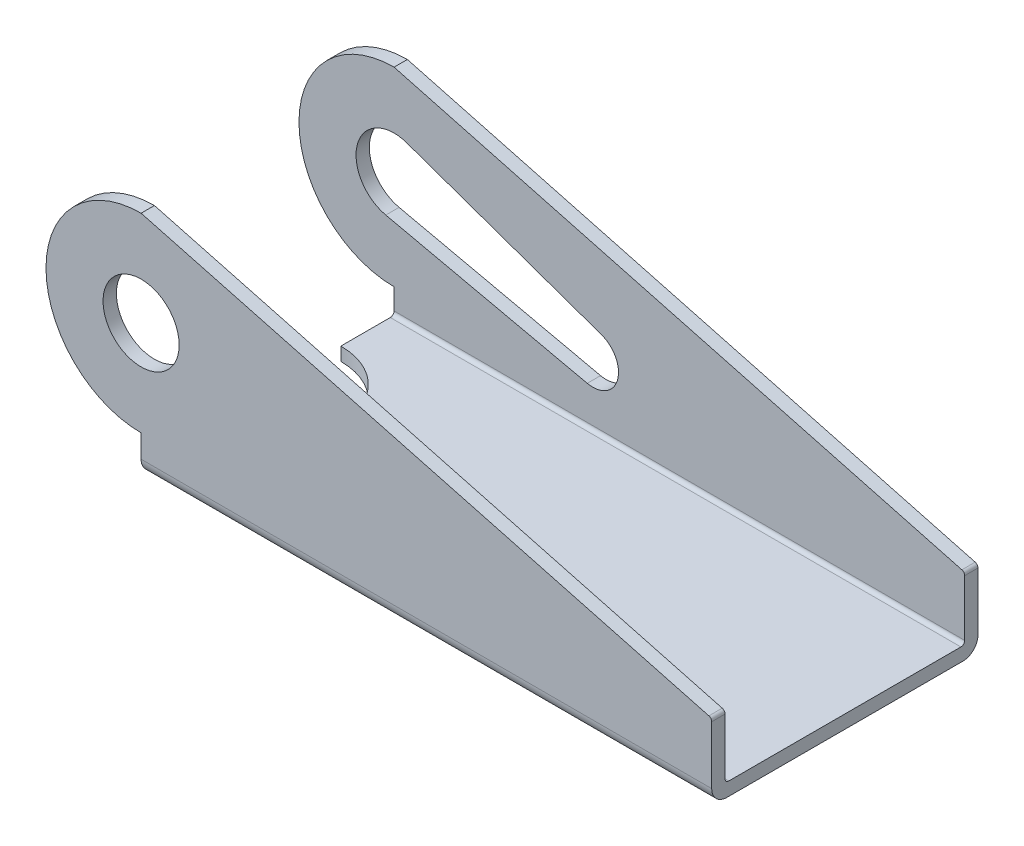
ISO-10303-21;
HEADER;
FILE_DESCRIPTION(('STEP AP214'),'2;1');
FILE_NAME('part.step','',(''),(''),'','','');
FILE_SCHEMA(('AUTOMOTIVE_DESIGN { 1 0 10303 214 1 1 1 1 }'));
ENDSEC;
DATA;
#1=APPLICATION_CONTEXT('core data for automotive mechanical design processes');
#2=APPLICATION_PROTOCOL_DEFINITION('international standard','automotive_design',2000,#1);
#3=PRODUCT_CONTEXT('',#1,'mechanical');
#4=PRODUCT('Part','Part','',(#3));
#5=PRODUCT_RELATED_PRODUCT_CATEGORY('part','',(#4));
#6=PRODUCT_DEFINITION_FORMATION('','',#4);
#7=PRODUCT_DEFINITION_CONTEXT('part definition',#1,'design');
#8=PRODUCT_DEFINITION('design','',#6,#7);
#9=PRODUCT_DEFINITION_SHAPE('','',#8);
#10=(LENGTH_UNIT() NAMED_UNIT(*) SI_UNIT(.MILLI.,.METRE.));
#11=(NAMED_UNIT(*) PLANE_ANGLE_UNIT() SI_UNIT($,.RADIAN.));
#12=(NAMED_UNIT(*) SI_UNIT($,.STERADIAN.) SOLID_ANGLE_UNIT());
#13=UNCERTAINTY_MEASURE_WITH_UNIT(LENGTH_MEASURE(1.E-05),#10,'distance_accuracy_value','');
#14=(GEOMETRIC_REPRESENTATION_CONTEXT(3) GLOBAL_UNCERTAINTY_ASSIGNED_CONTEXT((#13)) GLOBAL_UNIT_ASSIGNED_CONTEXT((#10,
#11,#12)) REPRESENTATION_CONTEXT('',''));
#15=CARTESIAN_POINT('',(0.,0.,0.));
#16=DIRECTION('',(0.,0.,1.));
#17=DIRECTION('',(1.,0.,0.));
#18=AXIS2_PLACEMENT_3D('',#15,#16,#17);
#19=CARTESIAN_POINT('',(-19.05,8.89,8.89));
#20=DIRECTION('',(0.,0.,1.));
#21=DIRECTION('',(1.,0.,0.));
#22=AXIS2_PLACEMENT_3D('',#19,#20,#21);
#23=CYLINDRICAL_SURFACE('',#22,2.54);
#24=DIRECTION('',(0.,0.,1.));
#25=VECTOR('',#24,1.);
#26=CARTESIAN_POINT('',(-18.2044160336769,11.2851174826921,-8.89));
#27=LINE('',#26,#25);
#28=CARTESIAN_POINT('',(-18.2044160336769,11.2851174826921,-8.89));
#29=VERTEX_POINT('',#28);
#30=CARTESIAN_POINT('',(-18.2044160336769,11.2851174826921,-8.001));
#31=VERTEX_POINT('',#30);
#32=EDGE_CURVE('E418',#29,#31,#27,.T.);
#33=ORIENTED_EDGE('',*,*,#32,.T.);
#34=CARTESIAN_POINT('',(-19.05,8.89,-8.001));
#35=DIRECTION('',(0.,0.,-1.));
#36=DIRECTION('',(0.,1.,0.));
#37=AXIS2_PLACEMENT_3D('',#34,#35,#36);
#38=CIRCLE('',#37,2.54);
#39=CARTESIAN_POINT('',(-19.603662052658,6.41107718324137,-8.001));
#40=VERTEX_POINT('',#39);
#41=EDGE_CURVE('E208',#40,#31,#38,.T.);
#42=ORIENTED_EDGE('',*,*,#41,.F.);
#43=DIRECTION('',(0.,0.,1.));
#44=VECTOR('',#43,1.);
#45=CARTESIAN_POINT('',(-19.603662052658,6.41107718324137,-8.89));
#46=LINE('',#45,#44);
#47=CARTESIAN_POINT('',(-19.603662052658,6.41107718324137,-8.89));
#48=VERTEX_POINT('',#47);
#49=EDGE_CURVE('E191',#48,#40,#46,.T.);
#50=ORIENTED_EDGE('',*,*,#49,.F.);
#51=CARTESIAN_POINT('',(-19.05,8.89,-8.89));
#52=DIRECTION('',(0.,0.,1.));
#53=DIRECTION('',(1.,0.,0.));
#54=AXIS2_PLACEMENT_3D('',#51,#52,#53);
#55=CIRCLE('',#54,2.54);
#56=EDGE_CURVE('E206',#29,#48,#55,.T.);
#57=ORIENTED_EDGE('',*,*,#56,.F.);
#58=EDGE_LOOP('',(#33,#42,#50,#57));
#59=FACE_BOUND('',#58,.T.);
#60=ADVANCED_FACE('F41',(#59),#23,.F.);
#61=CARTESIAN_POINT('',(-19.05,0.,-8.89));
#62=DIRECTION('',(-1.,0.,0.));
#63=DIRECTION('',(0.,0.,1.));
#64=AXIS2_PLACEMENT_3D('',#61,#62,#63);
#65=PLANE('',#64);
#66=DIRECTION('',(0.,0.,1.));
#67=VECTOR('',#66,1.);
#68=CARTESIAN_POINT('',(-19.05,0.,-8.89));
#69=LINE('',#68,#67);
#70=CARTESIAN_POINT('',(-19.05,0.,4.445));
#71=VERTEX_POINT('',#70);
#72=CARTESIAN_POINT('',(-19.05,0.,7.874));
#73=VERTEX_POINT('',#72);
#74=EDGE_CURVE('E265',#71,#73,#69,.T.);
#75=ORIENTED_EDGE('',*,*,#74,.T.);
#76=CARTESIAN_POINT('',(-19.05,1.016,7.874));
#77=DIRECTION('',(-1.,0.,0.));
#78=DIRECTION('',(0.,0.,1.));
#79=AXIS2_PLACEMENT_3D('',#76,#77,#78);
#80=CIRCLE('',#79,1.016);
#81=CARTESIAN_POINT('',(-19.05,1.016,8.89));
#82=VERTEX_POINT('',#81);
#83=EDGE_CURVE('E331',#73,#82,#80,.T.);
#84=ORIENTED_EDGE('',*,*,#83,.T.);
#85=DIRECTION('',(0.,-1.,0.));
#86=VECTOR('',#85,1.);
#87=CARTESIAN_POINT('',(-19.05,0.,8.89));
#88=LINE('',#87,#86);
#89=CARTESIAN_POINT('',(-19.05,2.54,8.89));
#90=VERTEX_POINT('',#89);
#91=EDGE_CURVE('E246',#90,#82,#88,.T.);
#92=ORIENTED_EDGE('',*,*,#91,.F.);
#93=DIRECTION('',(0.,0.,1.));
#94=VECTOR('',#93,1.);
#95=CARTESIAN_POINT('',(-19.05,2.54,-8.89));
#96=LINE('',#95,#94);
#97=CARTESIAN_POINT('',(-19.05,2.54,8.001));
#98=VERTEX_POINT('',#97);
#99=EDGE_CURVE('E270',#98,#90,#96,.T.);
#100=ORIENTED_EDGE('',*,*,#99,.F.);
#101=DIRECTION('',(0.,1.,0.));
#102=VECTOR('',#101,1.);
#103=CARTESIAN_POINT('',(-19.05,0.,8.00099999999999));
#104=LINE('',#103,#102);
#105=CARTESIAN_POINT('',(-19.05,1.143,8.00099999999999));
#106=VERTEX_POINT('',#105);
#107=EDGE_CURVE('E234',#106,#98,#104,.T.);
#108=ORIENTED_EDGE('',*,*,#107,.F.);
#109=CARTESIAN_POINT('',(-19.05,1.143,7.747));
#110=DIRECTION('',(-1.,0.,0.));
#111=DIRECTION('',(0.,0.,1.));
#112=AXIS2_PLACEMENT_3D('',#109,#110,#111);
#113=CIRCLE('',#112,0.254);
#114=CARTESIAN_POINT('',(-19.05,0.889,7.747));
#115=VERTEX_POINT('',#114);
#116=EDGE_CURVE('E313',#106,#115,#113,.F.);
#117=ORIENTED_EDGE('',*,*,#116,.T.);
#118=DIRECTION('',(0.,0.,1.));
#119=VECTOR('',#118,1.);
#120=CARTESIAN_POINT('',(-19.05,0.889,-8.89));
#121=LINE('',#120,#119);
#122=CARTESIAN_POINT('',(-19.05,0.889,4.445));
#123=VERTEX_POINT('',#122);
#124=EDGE_CURVE('E236',#123,#115,#121,.T.);
#125=ORIENTED_EDGE('',*,*,#124,.F.);
#126=DIRECTION('',(0.,1.,0.));
#127=VECTOR('',#126,1.);
#128=CARTESIAN_POINT('',(-19.05,0.889,4.445));
#129=LINE('',#128,#127);
#130=EDGE_CURVE('E218',#71,#123,#129,.T.);
#131=ORIENTED_EDGE('',*,*,#130,.F.);
#132=EDGE_LOOP('',(#75,#84,#92,#100,#108,#117,#125,#131));
#133=FACE_BOUND('',#132,.T.);
#134=ADVANCED_FACE('F336',(#133),#65,.T.);
#135=CARTESIAN_POINT('',(-19.05,0.,-8.89));
#136=DIRECTION('',(0.,-1.,0.));
#137=DIRECTION('',(1.,0.,0.));
#138=AXIS2_PLACEMENT_3D('',#135,#136,#137);
#139=PLANE('',#138);
#140=DIRECTION('',(0.,0.,1.));
#141=VECTOR('',#140,1.);
#142=CARTESIAN_POINT('',(19.05,0.,-8.89));
#143=LINE('',#142,#141);
#144=CARTESIAN_POINT('',(19.05,0.,-7.874));
#145=VERTEX_POINT('',#144);
#146=CARTESIAN_POINT('',(19.05,0.,7.874));
#147=VERTEX_POINT('',#146);
#148=EDGE_CURVE('E275',#145,#147,#143,.T.);
#149=ORIENTED_EDGE('',*,*,#148,.T.);
#150=DIRECTION('',(1.,0.,0.));
#151=VECTOR('',#150,1.);
#152=CARTESIAN_POINT('',(-19.05,0.,7.874));
#153=LINE('',#152,#151);
#154=EDGE_CURVE('E329',#147,#73,#153,.F.);
#155=ORIENTED_EDGE('',*,*,#154,.T.);
#156=ORIENTED_EDGE('',*,*,#74,.F.);
#157=CARTESIAN_POINT('',(-19.05,0.,0.));
#158=DIRECTION('',(0.,1.,0.));
#159=DIRECTION('',(0.,0.,1.));
#160=AXIS2_PLACEMENT_3D('',#157,#158,#159);
#161=CIRCLE('',#160,4.445);
#162=CARTESIAN_POINT('',(-19.05,0.,-4.445));
#163=VERTEX_POINT('',#162);
#164=EDGE_CURVE('E407',#71,#163,#161,.T.);
#165=ORIENTED_EDGE('',*,*,#164,.T.);
#166=CARTESIAN_POINT('',(-19.05,0.,-7.874));
#167=VERTEX_POINT('',#166);
#168=EDGE_CURVE('E278',#167,#163,#69,.T.);
#169=ORIENTED_EDGE('',*,*,#168,.F.);
#170=DIRECTION('',(1.,0.,0.));
#171=VECTOR('',#170,1.);
#172=CARTESIAN_POINT('',(-19.05,0.,-7.874));
#173=LINE('',#172,#171);
#174=EDGE_CURVE('E326',#167,#145,#173,.T.);
#175=ORIENTED_EDGE('',*,*,#174,.T.);
#176=EDGE_LOOP('',(#149,#155,#156,#165,#169,#175));
#177=FACE_BOUND('',#176,.T.);
#178=ADVANCED_FACE('F352',(#177),#139,.T.);
#179=CARTESIAN_POINT('',(-19.05,8.89,-8.89));
#180=DIRECTION('',(0.,0.,1.));
#181=DIRECTION('',(1.,0.,0.));
#182=AXIS2_PLACEMENT_3D('',#179,#180,#181);
#183=CYLINDRICAL_SURFACE('',#182,6.35);
#184=CARTESIAN_POINT('',(-19.05,8.89,-8.001));
#185=DIRECTION('',(0.,0.,-1.));
#186=DIRECTION('',(0.,1.,0.));
#187=AXIS2_PLACEMENT_3D('',#184,#185,#186);
#188=CIRCLE('',#187,6.35);
#189=CARTESIAN_POINT('',(-19.0499999999999,15.24,-8.001));
#190=VERTEX_POINT('',#189);
#191=CARTESIAN_POINT('',(-19.05,2.54,-8.001));
#192=VERTEX_POINT('',#191);
#193=EDGE_CURVE('E241',#190,#192,#188,.F.);
#194=ORIENTED_EDGE('',*,*,#193,.F.);
#195=DIRECTION('',(0.,0.,1.));
#196=VECTOR('',#195,1.);
#197=CARTESIAN_POINT('',(-19.05,15.24,-8.89));
#198=LINE('',#197,#196);
#199=CARTESIAN_POINT('',(-19.05,15.24,-8.89));
#200=VERTEX_POINT('',#199);
#201=EDGE_CURVE('E271',#200,#190,#198,.T.);
#202=ORIENTED_EDGE('',*,*,#201,.F.);
#203=CARTESIAN_POINT('',(-19.05,8.89,-8.89));
#204=DIRECTION('',(0.,0.,1.));
#205=DIRECTION('',(-1.,0.,0.));
#206=AXIS2_PLACEMENT_3D('',#203,#204,#205);
#207=CIRCLE('',#206,6.35);
#208=CARTESIAN_POINT('',(-19.05,2.54,-8.89));
#209=VERTEX_POINT('',#208);
#210=EDGE_CURVE('E262',#200,#209,#207,.T.);
#211=ORIENTED_EDGE('',*,*,#210,.T.);
#212=EDGE_CURVE('E266',#209,#192,#96,.T.);
#213=ORIENTED_EDGE('',*,*,#212,.T.);
#214=EDGE_LOOP('',(#194,#202,#211,#213));
#215=FACE_BOUND('',#214,.T.);
#216=ADVANCED_FACE('F477',(#215),#183,.T.);
#217=CARTESIAN_POINT('',(19.05,5.08,-8.89));
#218=DIRECTION('',(0.257662650560332,0.966234939601246,0.));
#219=DIRECTION('',(-0.966234939601246,0.257662650560332,0.));
#220=AXIS2_PLACEMENT_3D('',#217,#218,#219);
#221=PLANE('',#220);
#222=DIRECTION('',(-0.966234939601246,0.257662650560332,0.));
#223=VECTOR('',#222,1.);
#224=CARTESIAN_POINT('',(19.05,5.08,-8.001));
#225=LINE('',#224,#223);
#226=CARTESIAN_POINT('',(18.8614463132423,5.13028098313538,-8.001));
#227=VERTEX_POINT('',#226);
#228=EDGE_CURVE('E239',#227,#190,#225,.T.);
#229=ORIENTED_EDGE('',*,*,#228,.F.);
#230=DIRECTION('',(0.,0.,1.));
#231=VECTOR('',#230,1.);
#232=CARTESIAN_POINT('',(18.8614463132423,5.13028098313538,-8.89));
#233=LINE('',#232,#231);
#234=CARTESIAN_POINT('',(18.8614463132423,5.13028098313538,-8.89));
#235=VERTEX_POINT('',#234);
#236=EDGE_CURVE('E306',#227,#235,#233,.F.);
#237=ORIENTED_EDGE('',*,*,#236,.T.);
#238=DIRECTION('',(-0.966234939601246,0.257662650560332,0.));
#239=VECTOR('',#238,1.);
#240=CARTESIAN_POINT('',(19.05,5.08,-8.89));
#241=LINE('',#240,#239);
#242=EDGE_CURVE('E260',#235,#200,#241,.T.);
#243=ORIENTED_EDGE('',*,*,#242,.T.);
#244=ORIENTED_EDGE('',*,*,#201,.T.);
#245=EDGE_LOOP('',(#229,#237,#243,#244));
#246=FACE_BOUND('',#245,.T.);
#247=ADVANCED_FACE('F480',(#246),#221,.T.);
#248=DIRECTION('',(0.,-1.,0.));
#249=VECTOR('',#248,1.);
#250=CARTESIAN_POINT('',(-19.05,0.,-8.89));
#251=LINE('',#250,#249);
#252=CARTESIAN_POINT('',(-19.05,1.016,-8.89));
#253=VERTEX_POINT('',#252);
#254=EDGE_CURVE('E256',#209,#253,#251,.T.);
#255=ORIENTED_EDGE('',*,*,#254,.T.);
#256=CARTESIAN_POINT('',(-19.05,1.016,-7.874));
#257=DIRECTION('',(-1.,0.,0.));
#258=DIRECTION('',(0.,0.,1.));
#259=AXIS2_PLACEMENT_3D('',#256,#257,#258);
#260=CIRCLE('',#259,1.016);
#261=EDGE_CURVE('E11',#253,#167,#260,.T.);
#262=ORIENTED_EDGE('',*,*,#261,.T.);
#263=ORIENTED_EDGE('',*,*,#168,.T.);
#264=DIRECTION('',(0.,1.,0.));
#265=VECTOR('',#264,1.);
#266=CARTESIAN_POINT('',(-19.05,0.889,-4.445));
#267=LINE('',#266,#265);
#268=CARTESIAN_POINT('',(-19.05,0.889,-4.445));
#269=VERTEX_POINT('',#268);
#270=EDGE_CURVE('E406',#269,#163,#267,.F.);
#271=ORIENTED_EDGE('',*,*,#270,.F.);
#272=CARTESIAN_POINT('',(-19.05,0.889,-7.747));
#273=VERTEX_POINT('',#272);
#274=EDGE_CURVE('E237',#273,#269,#121,.T.);
#275=ORIENTED_EDGE('',*,*,#274,.F.);
#276=CARTESIAN_POINT('',(-19.05,1.143,-7.747));
#277=DIRECTION('',(-1.,0.,0.));
#278=DIRECTION('',(0.,0.,1.));
#279=AXIS2_PLACEMENT_3D('',#276,#277,#278);
#280=CIRCLE('',#279,0.254);
#281=CARTESIAN_POINT('',(-19.05,1.143,-8.001));
#282=VERTEX_POINT('',#281);
#283=EDGE_CURVE('E317',#273,#282,#280,.F.);
#284=ORIENTED_EDGE('',*,*,#283,.T.);
#285=DIRECTION('',(0.,-1.,0.));
#286=VECTOR('',#285,1.);
#287=CARTESIAN_POINT('',(-19.05,0.,-8.001));
#288=LINE('',#287,#286);
#289=EDGE_CURVE('E243',#192,#282,#288,.T.);
#290=ORIENTED_EDGE('',*,*,#289,.F.);
#291=ORIENTED_EDGE('',*,*,#212,.F.);
#292=EDGE_LOOP('',(#255,#262,#263,#271,#275,#284,#290,#291));
#293=FACE_BOUND('',#292,.T.);
#294=ADVANCED_FACE('F450',(#293),#65,.T.);
#295=CARTESIAN_POINT('',(-19.0499999999999,15.24,8.001));
#296=VERTEX_POINT('',#295);
#297=CARTESIAN_POINT('',(-19.05,15.24,8.89));
#298=VERTEX_POINT('',#297);
#299=EDGE_CURVE('E274',#296,#298,#198,.T.);
#300=ORIENTED_EDGE('',*,*,#299,.F.);
#301=CARTESIAN_POINT('',(-19.05,8.89,8.001));
#302=DIRECTION('',(0.,0.,1.));
#303=DIRECTION('',(0.,-1.,0.));
#304=AXIS2_PLACEMENT_3D('',#301,#302,#303);
#305=CIRCLE('',#304,6.35);
#306=EDGE_CURVE('E232',#98,#296,#305,.F.);
#307=ORIENTED_EDGE('',*,*,#306,.F.);
#308=ORIENTED_EDGE('',*,*,#99,.T.);
#309=CARTESIAN_POINT('',(-19.05,8.89,8.89));
#310=DIRECTION('',(0.,0.,1.));
#311=DIRECTION('',(-1.,0.,0.));
#312=AXIS2_PLACEMENT_3D('',#309,#310,#311);
#313=CIRCLE('',#312,6.35);
#314=EDGE_CURVE('E253',#298,#90,#313,.T.);
#315=ORIENTED_EDGE('',*,*,#314,.F.);
#316=EDGE_LOOP('',(#300,#307,#308,#315));
#317=FACE_BOUND('',#316,.T.);
#318=ADVANCED_FACE('F403',(#317),#183,.T.);
#319=DIRECTION('',(-0.966234939601246,0.257662650560332,0.));
#320=VECTOR('',#319,1.);
#321=CARTESIAN_POINT('',(19.05,5.08,8.89));
#322=LINE('',#321,#320);
#323=CARTESIAN_POINT('',(18.8614463132423,5.13028098313538,8.89));
#324=VERTEX_POINT('',#323);
#325=EDGE_CURVE('E251',#324,#298,#322,.T.);
#326=ORIENTED_EDGE('',*,*,#325,.F.);
#327=DIRECTION('',(0.,0.,1.));
#328=VECTOR('',#327,1.);
#329=CARTESIAN_POINT('',(18.8614463132423,5.13028098313538,-8.89));
#330=LINE('',#329,#328);
#331=CARTESIAN_POINT('',(18.8614463132423,5.13028098313538,8.001));
#332=VERTEX_POINT('',#331);
#333=EDGE_CURVE('E304',#324,#332,#330,.F.);
#334=ORIENTED_EDGE('',*,*,#333,.T.);
#335=DIRECTION('',(0.966234939601246,-0.257662650560332,0.));
#336=VECTOR('',#335,1.);
#337=CARTESIAN_POINT('',(19.05,5.08,8.001));
#338=LINE('',#337,#336);
#339=EDGE_CURVE('E229',#296,#332,#338,.T.);
#340=ORIENTED_EDGE('',*,*,#339,.F.);
#341=ORIENTED_EDGE('',*,*,#299,.T.);
#342=EDGE_LOOP('',(#326,#334,#340,#341));
#343=FACE_BOUND('',#342,.T.);
#344=ADVANCED_FACE('F399',(#343),#221,.T.);
#345=CARTESIAN_POINT('',(19.05,0.,-8.89));
#346=DIRECTION('',(1.,0.,0.));
#347=DIRECTION('',(0.,1.,0.));
#348=AXIS2_PLACEMENT_3D('',#345,#346,#347);
#349=PLANE('',#348);
#350=DIRECTION('',(0.,1.,0.));
#351=VECTOR('',#350,1.);
#352=CARTESIAN_POINT('',(19.05,0.,8.89));
#353=LINE('',#352,#351);
#354=CARTESIAN_POINT('',(19.05,1.016,8.89));
#355=VERTEX_POINT('',#354);
#356=CARTESIAN_POINT('',(19.05,4.88485730847666,8.89));
#357=VERTEX_POINT('',#356);
#358=EDGE_CURVE('E249',#355,#357,#353,.T.);
#359=ORIENTED_EDGE('',*,*,#358,.F.);
#360=CARTESIAN_POINT('',(19.05,1.016,7.874));
#361=DIRECTION('',(1.,0.,0.));
#362=DIRECTION('',(0.,1.,0.));
#363=AXIS2_PLACEMENT_3D('',#360,#361,#362);
#364=CIRCLE('',#363,1.016);
#365=EDGE_CURVE('E324',#355,#147,#364,.T.);
#366=ORIENTED_EDGE('',*,*,#365,.T.);
#367=ORIENTED_EDGE('',*,*,#148,.F.);
#368=CARTESIAN_POINT('',(19.05,1.016,-7.874));
#369=DIRECTION('',(1.,0.,0.));
#370=DIRECTION('',(0.,1.,0.));
#371=AXIS2_PLACEMENT_3D('',#368,#369,#370);
#372=CIRCLE('',#371,1.016);
#373=CARTESIAN_POINT('',(19.05,1.016,-8.89));
#374=VERTEX_POINT('',#373);
#375=EDGE_CURVE('E322',#145,#374,#372,.T.);
#376=ORIENTED_EDGE('',*,*,#375,.T.);
#377=DIRECTION('',(0.,1.,0.));
#378=VECTOR('',#377,1.);
#379=CARTESIAN_POINT('',(19.05,0.,-8.89));
#380=LINE('',#379,#378);
#381=CARTESIAN_POINT('',(19.05,4.88485730847666,-8.89));
#382=VERTEX_POINT('',#381);
#383=EDGE_CURVE('E258',#374,#382,#380,.T.);
#384=ORIENTED_EDGE('',*,*,#383,.T.);
#385=DIRECTION('',(0.,0.,1.));
#386=VECTOR('',#385,1.);
#387=CARTESIAN_POINT('',(19.05,4.88485730847666,-8.89));
#388=LINE('',#387,#386);
#389=CARTESIAN_POINT('',(19.05,4.88485730847666,-8.001));
#390=VERTEX_POINT('',#389);
#391=EDGE_CURVE('E296',#382,#390,#388,.T.);
#392=ORIENTED_EDGE('',*,*,#391,.T.);
#393=DIRECTION('',(0.,1.,0.));
#394=VECTOR('',#393,1.);
#395=CARTESIAN_POINT('',(19.05,0.889,-8.001));
#396=LINE('',#395,#394);
#397=CARTESIAN_POINT('',(19.05,1.143,-8.001));
#398=VERTEX_POINT('',#397);
#399=EDGE_CURVE('E226',#398,#390,#396,.T.);
#400=ORIENTED_EDGE('',*,*,#399,.F.);
#401=CARTESIAN_POINT('',(19.05,1.143,-7.747));
#402=DIRECTION('',(1.,0.,0.));
#403=DIRECTION('',(0.,1.,0.));
#404=AXIS2_PLACEMENT_3D('',#401,#402,#403);
#405=CIRCLE('',#404,0.254);
#406=CARTESIAN_POINT('',(19.05,0.889,-7.747));
#407=VERTEX_POINT('',#406);
#408=EDGE_CURVE('E315',#398,#407,#405,.F.);
#409=ORIENTED_EDGE('',*,*,#408,.T.);
#410=DIRECTION('',(0.,0.,-1.));
#411=VECTOR('',#410,1.);
#412=CARTESIAN_POINT('',(19.05,0.889,8.001));
#413=LINE('',#412,#411);
#414=CARTESIAN_POINT('',(19.05,0.889,7.747));
#415=VERTEX_POINT('',#414);
#416=EDGE_CURVE('E223',#415,#407,#413,.T.);
#417=ORIENTED_EDGE('',*,*,#416,.F.);
#418=CARTESIAN_POINT('',(19.05,1.143,7.747));
#419=DIRECTION('',(1.,0.,0.));
#420=DIRECTION('',(0.,1.,0.));
#421=AXIS2_PLACEMENT_3D('',#418,#419,#420);
#422=CIRCLE('',#421,0.254);
#423=CARTESIAN_POINT('',(19.05,1.143,8.00099999999999));
#424=VERTEX_POINT('',#423);
#425=EDGE_CURVE('E311',#415,#424,#422,.F.);
#426=ORIENTED_EDGE('',*,*,#425,.T.);
#427=DIRECTION('',(0.,-1.,0.));
#428=VECTOR('',#427,1.);
#429=CARTESIAN_POINT('',(19.05,0.,8.00099999999999));
#430=LINE('',#429,#428);
#431=CARTESIAN_POINT('',(19.05,4.88485730847666,8.00099999999999));
#432=VERTEX_POINT('',#431);
#433=EDGE_CURVE('E269',#432,#424,#430,.T.);
#434=ORIENTED_EDGE('',*,*,#433,.F.);
#435=DIRECTION('',(0.,0.,1.));
#436=VECTOR('',#435,1.);
#437=CARTESIAN_POINT('',(19.05,4.88485730847666,-8.89));
#438=LINE('',#437,#436);
#439=EDGE_CURVE('E299',#432,#357,#438,.T.);
#440=ORIENTED_EDGE('',*,*,#439,.T.);
#441=EDGE_LOOP('',(#359,#366,#367,#376,#384,#392,#400,#409,#417,#426,#434,#440));
#442=FACE_BOUND('',#441,.T.);
#443=ADVANCED_FACE('F350',(#442),#349,.T.);
#444=CARTESIAN_POINT('',(-19.05,8.89,-8.89));
#445=DIRECTION('',(0.,0.,-1.));
#446=DIRECTION('',(-1.,0.,0.));
#447=AXIS2_PLACEMENT_3D('',#444,#445,#446);
#448=PLANE('',#447);
#449=DIRECTION('',(-0.942959638855155,0.332907073355547,0.));
#450=VECTOR('',#449,1.);
#451=CARTESIAN_POINT('',(-5.20773082273191,6.69670430081716,-8.89));
#452=LINE('',#451,#450);
#453=CARTESIAN_POINT('',(-5.20773082273191,6.69670430081716,-8.89));
#454=VERTEX_POINT('',#453);
#455=EDGE_CURVE('E199',#454,#29,#452,.T.);
#456=ORIENTED_EDGE('',*,*,#455,.T.);
#457=ORIENTED_EDGE('',*,*,#56,.T.);
#458=DIRECTION('',(0.975953864865603,-0.217977186085819,0.));
#459=VECTOR('',#458,1.);
#460=CARTESIAN_POINT('',(-19.603662052658,6.41107718324137,-8.89));
#461=LINE('',#460,#459);
#462=CARTESIAN_POINT('',(-6.15222188554414,3.40672709868792,-8.89));
#463=VERTEX_POINT('',#462);
#464=EDGE_CURVE('E188',#48,#463,#461,.T.);
#465=ORIENTED_EDGE('',*,*,#464,.T.);
#466=CARTESIAN_POINT('',(-5.7785,5.08,-8.89));
#467=DIRECTION('',(0.,0.,-1.));
#468=DIRECTION('',(-1.,0.,0.));
#469=AXIS2_PLACEMENT_3D('',#466,#467,#468);
#470=CIRCLE('',#469,1.7145);
#471=EDGE_CURVE('E412',#454,#463,#470,.T.);
#472=ORIENTED_EDGE('',*,*,#471,.F.);
#473=EDGE_LOOP('',(#456,#457,#465,#472));
#474=FACE_BOUND('',#473,.T.);
#475=ORIENTED_EDGE('',*,*,#383,.F.);
#476=DIRECTION('',(1.,0.,0.));
#477=VECTOR('',#476,1.);
#478=CARTESIAN_POINT('',(-19.05,1.016,-8.89));
#479=LINE('',#478,#477);
#480=EDGE_CURVE('E49',#374,#253,#479,.F.);
#481=ORIENTED_EDGE('',*,*,#480,.T.);
#482=ORIENTED_EDGE('',*,*,#254,.F.);
#483=ORIENTED_EDGE('',*,*,#210,.F.);
#484=ORIENTED_EDGE('',*,*,#242,.F.);
#485=CARTESIAN_POINT('',(18.796,4.88485730847666,-8.89));
#486=DIRECTION('',(0.,0.,-1.));
#487=DIRECTION('',(-1.,0.,0.));
#488=AXIS2_PLACEMENT_3D('',#485,#486,#487);
#489=CIRCLE('',#488,0.254);
#490=EDGE_CURVE('E308',#235,#382,#489,.T.);
#491=ORIENTED_EDGE('',*,*,#490,.T.);
#492=EDGE_LOOP('',(#475,#481,#482,#483,#484,#491));
#493=FACE_BOUND('',#492,.T.);
#494=ADVANCED_FACE('F211',(#474,#493),#448,.T.);
#495=CARTESIAN_POINT('',(-19.05,8.89,8.89));
#496=DIRECTION('',(0.,0.,-1.));
#497=DIRECTION('',(-1.,0.,0.));
#498=AXIS2_PLACEMENT_3D('',#495,#496,#497);
#499=PLANE('',#498);
#500=CARTESIAN_POINT('',(-19.05,8.89,8.89));
#501=DIRECTION('',(0.,0.,1.));
#502=DIRECTION('',(1.,0.,0.));
#503=AXIS2_PLACEMENT_3D('',#500,#501,#502);
#504=CIRCLE('',#503,2.54);
#505=CARTESIAN_POINT('',(-16.51,8.89,8.89));
#506=VERTEX_POINT('',#505);
#507=EDGE_CURVE('E213',#506,#506,#504,.T.);
#508=ORIENTED_EDGE('',*,*,#507,.F.);
#509=EDGE_LOOP('',(#508));
#510=FACE_BOUND('',#509,.T.);
#511=ORIENTED_EDGE('',*,*,#91,.T.);
#512=DIRECTION('',(1.,0.,0.));
#513=VECTOR('',#512,1.);
#514=CARTESIAN_POINT('',(19.05,1.016,8.89));
#515=LINE('',#514,#513);
#516=EDGE_CURVE('E319',#82,#355,#515,.T.);
#517=ORIENTED_EDGE('',*,*,#516,.T.);
#518=ORIENTED_EDGE('',*,*,#358,.T.);
#519=CARTESIAN_POINT('',(18.796,4.88485730847666,8.89));
#520=DIRECTION('',(0.,0.,-1.));
#521=DIRECTION('',(-1.,0.,0.));
#522=AXIS2_PLACEMENT_3D('',#519,#520,#521);
#523=CIRCLE('',#522,0.254);
#524=EDGE_CURVE('E302',#357,#324,#523,.F.);
#525=ORIENTED_EDGE('',*,*,#524,.T.);
#526=ORIENTED_EDGE('',*,*,#325,.T.);
#527=ORIENTED_EDGE('',*,*,#314,.T.);
#528=EDGE_LOOP('',(#511,#517,#518,#525,#526,#527));
#529=FACE_BOUND('',#528,.T.);
#530=ADVANCED_FACE('F344',(#510,#529),#499,.F.);
#531=CARTESIAN_POINT('',(-25.4,0.889,-8.001));
#532=DIRECTION('',(0.,0.,-1.));
#533=DIRECTION('',(0.,1.,0.));
#534=AXIS2_PLACEMENT_3D('',#531,#532,#533);
#535=PLANE('',#534);
#536=ORIENTED_EDGE('',*,*,#41,.T.);
#537=DIRECTION('',(-0.942959638855155,0.332907073355547,0.));
#538=VECTOR('',#537,1.);
#539=CARTESIAN_POINT('',(-5.20773082273191,6.69670430081716,-8.001));
#540=LINE('',#539,#538);
#541=CARTESIAN_POINT('',(-5.20773082273191,6.69670430081716,-8.001));
#542=VERTEX_POINT('',#541);
#543=EDGE_CURVE('E200',#542,#31,#540,.T.);
#544=ORIENTED_EDGE('',*,*,#543,.F.);
#545=CARTESIAN_POINT('',(-5.7785,5.08,-8.001));
#546=DIRECTION('',(0.,0.,1.));
#547=DIRECTION('',(1.,0.,0.));
#548=AXIS2_PLACEMENT_3D('',#545,#546,#547);
#549=CIRCLE('',#548,1.7145);
#550=CARTESIAN_POINT('',(-6.15222188554414,3.40672709868792,-8.001));
#551=VERTEX_POINT('',#550);
#552=EDGE_CURVE('E416',#551,#542,#549,.T.);
#553=ORIENTED_EDGE('',*,*,#552,.F.);
#554=DIRECTION('',(0.975953864865603,-0.217977186085819,0.));
#555=VECTOR('',#554,1.);
#556=CARTESIAN_POINT('',(-19.603662052658,6.41107718324137,-8.001));
#557=LINE('',#556,#555);
#558=EDGE_CURVE('E425',#40,#551,#557,.T.);
#559=ORIENTED_EDGE('',*,*,#558,.F.);
#560=EDGE_LOOP('',(#536,#544,#553,#559));
#561=FACE_BOUND('',#560,.T.);
#562=ORIENTED_EDGE('',*,*,#289,.T.);
#563=DIRECTION('',(1.,0.,0.));
#564=VECTOR('',#563,1.);
#565=CARTESIAN_POINT('',(19.05,1.143,-8.001));
#566=LINE('',#565,#564);
#567=EDGE_CURVE('E293',#282,#398,#566,.T.);
#568=ORIENTED_EDGE('',*,*,#567,.T.);
#569=ORIENTED_EDGE('',*,*,#399,.T.);
#570=CARTESIAN_POINT('',(18.796,4.88485730847666,-8.001));
#571=DIRECTION('',(0.,0.,-1.));
#572=DIRECTION('',(0.,1.,0.));
#573=AXIS2_PLACEMENT_3D('',#570,#571,#572);
#574=CIRCLE('',#573,0.254);
#575=EDGE_CURVE('E291',#390,#227,#574,.F.);
#576=ORIENTED_EDGE('',*,*,#575,.T.);
#577=ORIENTED_EDGE('',*,*,#228,.T.);
#578=ORIENTED_EDGE('',*,*,#193,.T.);
#579=EDGE_LOOP('',(#562,#568,#569,#576,#577,#578));
#580=FACE_BOUND('',#579,.T.);
#581=ADVANCED_FACE('F365',(#561,#580),#535,.F.);
#582=CARTESIAN_POINT('',(-25.4,0.889,8.001));
#583=DIRECTION('',(0.,-1.,0.));
#584=DIRECTION('',(0.,0.,-1.));
#585=AXIS2_PLACEMENT_3D('',#582,#583,#584);
#586=PLANE('',#585);
#587=ORIENTED_EDGE('',*,*,#124,.T.);
#588=DIRECTION('',(1.,0.,0.));
#589=VECTOR('',#588,1.);
#590=CARTESIAN_POINT('',(19.05,0.889,7.747));
#591=LINE('',#590,#589);
#592=EDGE_CURVE('E284',#115,#415,#591,.T.);
#593=ORIENTED_EDGE('',*,*,#592,.T.);
#594=ORIENTED_EDGE('',*,*,#416,.T.);
#595=DIRECTION('',(1.,0.,0.));
#596=VECTOR('',#595,1.);
#597=CARTESIAN_POINT('',(-19.05,0.889,-7.747));
#598=LINE('',#597,#596);
#599=EDGE_CURVE('E281',#407,#273,#598,.F.);
#600=ORIENTED_EDGE('',*,*,#599,.T.);
#601=ORIENTED_EDGE('',*,*,#274,.T.);
#602=CARTESIAN_POINT('',(-19.05,0.889,0.));
#603=DIRECTION('',(0.,1.,0.));
#604=DIRECTION('',(0.,0.,1.));
#605=AXIS2_PLACEMENT_3D('',#602,#603,#604);
#606=CIRCLE('',#605,4.445);
#607=EDGE_CURVE('E409',#123,#269,#606,.T.);
#608=ORIENTED_EDGE('',*,*,#607,.F.);
#609=EDGE_LOOP('',(#587,#593,#594,#600,#601,#608));
#610=FACE_BOUND('',#609,.T.);
#611=ADVANCED_FACE('F376',(#610),#586,.F.);
#612=CARTESIAN_POINT('',(-25.4,15.24,8.001));
#613=DIRECTION('',(0.,0.,1.));
#614=DIRECTION('',(0.,-1.,0.));
#615=AXIS2_PLACEMENT_3D('',#612,#613,#614);
#616=PLANE('',#615);
#617=CARTESIAN_POINT('',(-19.05,8.89,8.001));
#618=DIRECTION('',(0.,0.,1.));
#619=DIRECTION('',(0.,-1.,0.));
#620=AXIS2_PLACEMENT_3D('',#617,#618,#619);
#621=CIRCLE('',#620,2.54);
#622=CARTESIAN_POINT('',(-19.05,6.35,8.001));
#623=VERTEX_POINT('',#622);
#624=EDGE_CURVE('E212',#623,#623,#621,.T.);
#625=ORIENTED_EDGE('',*,*,#624,.T.);
#626=EDGE_LOOP('',(#625));
#627=FACE_BOUND('',#626,.T.);
#628=ORIENTED_EDGE('',*,*,#433,.T.);
#629=DIRECTION('',(1.,0.,0.));
#630=VECTOR('',#629,1.);
#631=CARTESIAN_POINT('',(-19.05,1.143,8.001));
#632=LINE('',#631,#630);
#633=EDGE_CURVE('E289',#424,#106,#632,.F.);
#634=ORIENTED_EDGE('',*,*,#633,.T.);
#635=ORIENTED_EDGE('',*,*,#107,.T.);
#636=ORIENTED_EDGE('',*,*,#306,.T.);
#637=ORIENTED_EDGE('',*,*,#339,.T.);
#638=CARTESIAN_POINT('',(18.796,4.88485730847666,8.001));
#639=DIRECTION('',(0.,0.,1.));
#640=DIRECTION('',(0.,-1.,0.));
#641=AXIS2_PLACEMENT_3D('',#638,#639,#640);
#642=CIRCLE('',#641,0.254);
#643=EDGE_CURVE('E287',#332,#432,#642,.F.);
#644=ORIENTED_EDGE('',*,*,#643,.T.);
#645=EDGE_LOOP('',(#628,#634,#635,#636,#637,#644));
#646=FACE_BOUND('',#645,.T.);
#647=ADVANCED_FACE('F388',(#627,#646),#616,.F.);
#648=ORIENTED_EDGE('',*,*,#507,.T.);
#649=EDGE_LOOP('',(#648));
#650=FACE_BOUND('',#649,.T.);
#651=ORIENTED_EDGE('',*,*,#624,.F.);
#652=EDGE_LOOP('',(#651));
#653=FACE_BOUND('',#652,.T.);
#654=ADVANCED_FACE('F445',(#650,#653),#23,.F.);
#655=CARTESIAN_POINT('',(-19.05,0.889,0.));
#656=DIRECTION('',(0.,1.,0.));
#657=DIRECTION('',(0.,0.,1.));
#658=AXIS2_PLACEMENT_3D('',#655,#656,#657);
#659=CYLINDRICAL_SURFACE('',#658,4.445);
#660=ORIENTED_EDGE('',*,*,#130,.T.);
#661=ORIENTED_EDGE('',*,*,#607,.T.);
#662=ORIENTED_EDGE('',*,*,#270,.T.);
#663=ORIENTED_EDGE('',*,*,#164,.F.);
#664=EDGE_LOOP('',(#660,#661,#662,#663));
#665=FACE_BOUND('',#664,.T.);
#666=ADVANCED_FACE('F454',(#665),#659,.F.);
#667=CARTESIAN_POINT('',(-5.7785,5.08,-8.001));
#668=DIRECTION('',(0.,0.,1.));
#669=DIRECTION('',(1.,0.,0.));
#670=AXIS2_PLACEMENT_3D('',#667,#668,#669);
#671=CYLINDRICAL_SURFACE('',#670,1.7145);
#672=ORIENTED_EDGE('',*,*,#552,.T.);
#673=DIRECTION('',(0.,0.,1.));
#674=VECTOR('',#673,1.);
#675=CARTESIAN_POINT('',(-5.20773082273191,6.69670430081716,-8.89));
#676=LINE('',#675,#674);
#677=EDGE_CURVE('E421',#454,#542,#676,.T.);
#678=ORIENTED_EDGE('',*,*,#677,.F.);
#679=ORIENTED_EDGE('',*,*,#471,.T.);
#680=DIRECTION('',(0.,0.,1.));
#681=VECTOR('',#680,1.);
#682=CARTESIAN_POINT('',(-6.15222188554414,3.40672709868792,-8.89));
#683=LINE('',#682,#681);
#684=EDGE_CURVE('E194',#463,#551,#683,.T.);
#685=ORIENTED_EDGE('',*,*,#684,.T.);
#686=EDGE_LOOP('',(#672,#678,#679,#685));
#687=FACE_BOUND('',#686,.T.);
#688=ADVANCED_FACE('F430',(#687),#671,.F.);
#689=CARTESIAN_POINT('',(-19.603662052658,6.41107718324137,-8.89));
#690=DIRECTION('',(-0.217977186085819,-0.975953864865603,0.));
#691=DIRECTION('',(0.975953864865603,-0.217977186085819,0.));
#692=AXIS2_PLACEMENT_3D('',#689,#690,#691);
#693=PLANE('',#692);
#694=ORIENTED_EDGE('',*,*,#558,.T.);
#695=ORIENTED_EDGE('',*,*,#684,.F.);
#696=ORIENTED_EDGE('',*,*,#464,.F.);
#697=ORIENTED_EDGE('',*,*,#49,.T.);
#698=EDGE_LOOP('',(#694,#695,#696,#697));
#699=FACE_BOUND('',#698,.T.);
#700=ADVANCED_FACE('F190',(#699),#693,.F.);
#701=CARTESIAN_POINT('',(-5.20773082273191,6.69670430081716,-8.89));
#702=DIRECTION('',(0.332907073355547,0.942959638855155,0.));
#703=DIRECTION('',(-0.942959638855155,0.332907073355547,0.));
#704=AXIS2_PLACEMENT_3D('',#701,#702,#703);
#705=PLANE('',#704);
#706=ORIENTED_EDGE('',*,*,#543,.T.);
#707=ORIENTED_EDGE('',*,*,#32,.F.);
#708=ORIENTED_EDGE('',*,*,#455,.F.);
#709=ORIENTED_EDGE('',*,*,#677,.T.);
#710=EDGE_LOOP('',(#706,#707,#708,#709));
#711=FACE_BOUND('',#710,.T.);
#712=ADVANCED_FACE('F434',(#711),#705,.F.);
#713=CARTESIAN_POINT('',(-25.4,1.143,7.747));
#714=DIRECTION('',(-1.,0.,0.));
#715=DIRECTION('',(0.,0.,1.));
#716=AXIS2_PLACEMENT_3D('',#713,#714,#715);
#717=CYLINDRICAL_SURFACE('',#716,0.254);
#718=ORIENTED_EDGE('',*,*,#116,.F.);
#719=ORIENTED_EDGE('',*,*,#633,.F.);
#720=ORIENTED_EDGE('',*,*,#425,.F.);
#721=ORIENTED_EDGE('',*,*,#592,.F.);
#722=EDGE_LOOP('',(#718,#719,#720,#721));
#723=FACE_BOUND('',#722,.T.);
#724=ADVANCED_FACE('F383',(#723),#717,.F.);
#725=CARTESIAN_POINT('',(-25.4,1.143,-7.747));
#726=DIRECTION('',(-1.,0.,0.));
#727=DIRECTION('',(0.,0.,1.));
#728=AXIS2_PLACEMENT_3D('',#725,#726,#727);
#729=CYLINDRICAL_SURFACE('',#728,0.254);
#730=ORIENTED_EDGE('',*,*,#283,.F.);
#731=ORIENTED_EDGE('',*,*,#599,.F.);
#732=ORIENTED_EDGE('',*,*,#408,.F.);
#733=ORIENTED_EDGE('',*,*,#567,.F.);
#734=EDGE_LOOP('',(#730,#731,#732,#733));
#735=FACE_BOUND('',#734,.T.);
#736=ADVANCED_FACE('F371',(#735),#729,.F.);
#737=CARTESIAN_POINT('',(18.796,4.88485730847666,-8.89));
#738=DIRECTION('',(0.,0.,1.));
#739=DIRECTION('',(1.,0.,0.));
#740=AXIS2_PLACEMENT_3D('',#737,#738,#739);
#741=CYLINDRICAL_SURFACE('',#740,0.254);
#742=ORIENTED_EDGE('',*,*,#643,.F.);
#743=ORIENTED_EDGE('',*,*,#333,.F.);
#744=ORIENTED_EDGE('',*,*,#524,.F.);
#745=ORIENTED_EDGE('',*,*,#439,.F.);
#746=EDGE_LOOP('',(#742,#743,#744,#745));
#747=FACE_BOUND('',#746,.T.);
#748=ADVANCED_FACE('F394',(#747),#741,.T.);
#749=CARTESIAN_POINT('',(18.796,4.88485730847666,-8.89));
#750=DIRECTION('',(0.,0.,1.));
#751=DIRECTION('',(1.,0.,0.));
#752=AXIS2_PLACEMENT_3D('',#749,#750,#751);
#753=CYLINDRICAL_SURFACE('',#752,0.254);
#754=ORIENTED_EDGE('',*,*,#490,.F.);
#755=ORIENTED_EDGE('',*,*,#236,.F.);
#756=ORIENTED_EDGE('',*,*,#575,.F.);
#757=ORIENTED_EDGE('',*,*,#391,.F.);
#758=EDGE_LOOP('',(#754,#755,#756,#757));
#759=FACE_BOUND('',#758,.T.);
#760=ADVANCED_FACE('F362',(#759),#753,.T.);
#761=CARTESIAN_POINT('',(-19.05,1.016,7.874));
#762=DIRECTION('',(-1.,0.,0.));
#763=DIRECTION('',(0.,-1.,0.));
#764=AXIS2_PLACEMENT_3D('',#761,#762,#763);
#765=CYLINDRICAL_SURFACE('',#764,1.016);
#766=ORIENTED_EDGE('',*,*,#83,.F.);
#767=ORIENTED_EDGE('',*,*,#154,.F.);
#768=ORIENTED_EDGE('',*,*,#365,.F.);
#769=ORIENTED_EDGE('',*,*,#516,.F.);
#770=EDGE_LOOP('',(#766,#767,#768,#769));
#771=FACE_BOUND('',#770,.T.);
#772=ADVANCED_FACE('F347',(#771),#765,.T.);
#773=CARTESIAN_POINT('',(-19.05,1.016,-7.874));
#774=DIRECTION('',(1.,0.,0.));
#775=DIRECTION('',(0.,1.,0.));
#776=AXIS2_PLACEMENT_3D('',#773,#774,#775);
#777=CYLINDRICAL_SURFACE('',#776,1.016);
#778=ORIENTED_EDGE('',*,*,#261,.F.);
#779=ORIENTED_EDGE('',*,*,#480,.F.);
#780=ORIENTED_EDGE('',*,*,#375,.F.);
#781=ORIENTED_EDGE('',*,*,#174,.F.);
#782=EDGE_LOOP('',(#778,#779,#780,#781));
#783=FACE_BOUND('',#782,.T.);
#784=ADVANCED_FACE('F43',(#783),#777,.T.);
#785=CLOSED_SHELL('',(#60,#134,#178,#216,#247,#294,#318,#344,#443,#494,#530,#581,#611,#647,#654,
#666,#688,#700,#712,#724,#736,#748,#760,#772,#784));
#786=MANIFOLD_SOLID_BREP('B2',#785);
#787=ADVANCED_BREP_SHAPE_REPRESENTATION('',(#18,#786),#14);
#788=SHAPE_DEFINITION_REPRESENTATION(#9,#787);
ENDSEC;
END-ISO-10303-21;
